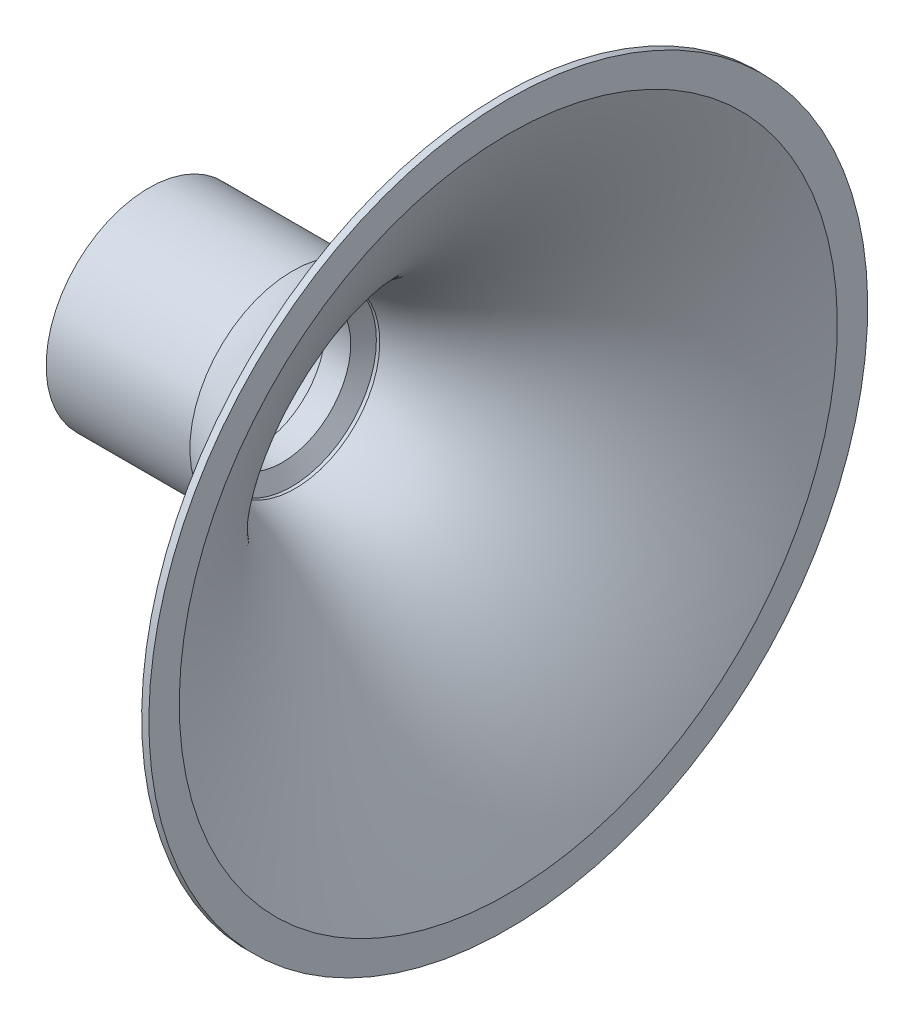
ISO-10303-21;
HEADER;
FILE_DESCRIPTION(('STEP AP214'),'2;1');
FILE_NAME('part.step','',(''),(''),'','','');
FILE_SCHEMA(('AUTOMOTIVE_DESIGN { 1 0 10303 214 1 1 1 1 }'));
ENDSEC;
DATA;
#1=APPLICATION_CONTEXT('core data for automotive mechanical design processes');
#2=APPLICATION_PROTOCOL_DEFINITION('international standard','automotive_design',2000,#1);
#3=PRODUCT_CONTEXT('',#1,'mechanical');
#4=PRODUCT('Part','Part','',(#3));
#5=PRODUCT_RELATED_PRODUCT_CATEGORY('part','',(#4));
#6=PRODUCT_DEFINITION_FORMATION('','',#4);
#7=PRODUCT_DEFINITION_CONTEXT('part definition',#1,'design');
#8=PRODUCT_DEFINITION('design','',#6,#7);
#9=PRODUCT_DEFINITION_SHAPE('','',#8);
#10=(LENGTH_UNIT() NAMED_UNIT(*) SI_UNIT(.MILLI.,.METRE.));
#11=(NAMED_UNIT(*) PLANE_ANGLE_UNIT() SI_UNIT($,.RADIAN.));
#12=(NAMED_UNIT(*) SI_UNIT($,.STERADIAN.) SOLID_ANGLE_UNIT());
#13=UNCERTAINTY_MEASURE_WITH_UNIT(LENGTH_MEASURE(1.E-05),#10,'distance_accuracy_value','');
#14=(GEOMETRIC_REPRESENTATION_CONTEXT(3) GLOBAL_UNCERTAINTY_ASSIGNED_CONTEXT((#13)) GLOBAL_UNIT_ASSIGNED_CONTEXT((#10,
#11,#12)) REPRESENTATION_CONTEXT('',''));
#15=CARTESIAN_POINT('',(0.,0.,0.));
#16=DIRECTION('',(0.,0.,1.));
#17=DIRECTION('',(1.,0.,0.));
#18=AXIS2_PLACEMENT_3D('',#15,#16,#17);
#19=CARTESIAN_POINT('',(20.,0.,0.));
#20=DIRECTION('',(-1.,0.,0.));
#21=DIRECTION('',(0.,0.,1.));
#22=AXIS2_PLACEMENT_3D('',#19,#20,#21);
#23=CYLINDRICAL_SURFACE('',#22,11.3);
#24=CARTESIAN_POINT('',(0.999999999999987,0.,0.));
#25=DIRECTION('',(1.,0.,0.));
#26=DIRECTION('',(0.,0.,-1.));
#27=AXIS2_PLACEMENT_3D('',#24,#25,#26);
#28=CIRCLE('',#27,11.3);
#29=CARTESIAN_POINT('',(0.999999999999987,0.,-11.3));
#30=VERTEX_POINT('',#29);
#31=EDGE_CURVE('E10',#30,#30,#28,.F.);
#32=ORIENTED_EDGE('',*,*,#31,.T.);
#33=EDGE_LOOP('',(#32));
#34=FACE_BOUND('',#33,.T.);
#35=CARTESIAN_POINT('',(15.,0.,0.));
#36=DIRECTION('',(1.,0.,0.));
#37=DIRECTION('',(0.,0.,-1.));
#38=AXIS2_PLACEMENT_3D('',#35,#36,#37);
#39=CIRCLE('',#38,11.3);
#40=CARTESIAN_POINT('',(15.,0.,-11.3));
#41=VERTEX_POINT('',#40);
#42=EDGE_CURVE('E147',#41,#41,#39,.T.);
#43=ORIENTED_EDGE('',*,*,#42,.T.);
#44=EDGE_LOOP('',(#43));
#45=FACE_BOUND('',#44,.T.);
#46=ADVANCED_FACE('F44',(#34,#45),#23,.F.);
#47=CARTESIAN_POINT('',(0.,0.,0.));
#48=DIRECTION('',(1.,0.,0.));
#49=DIRECTION('',(0.,0.,-1.));
#50=AXIS2_PLACEMENT_3D('',#47,#48,#49);
#51=PLANE('',#50);
#52=CARTESIAN_POINT('',(0.,0.,0.));
#53=DIRECTION('',(1.,0.,0.));
#54=DIRECTION('',(0.,0.,-1.));
#55=AXIS2_PLACEMENT_3D('',#52,#53,#54);
#56=CIRCLE('',#55,11.8773502691896);
#57=CARTESIAN_POINT('',(0.,0.,-11.8773502691896));
#58=VERTEX_POINT('',#57);
#59=EDGE_CURVE('E53',#58,#58,#56,.T.);
#60=ORIENTED_EDGE('',*,*,#59,.T.);
#61=EDGE_LOOP('',(#60));
#62=FACE_BOUND('',#61,.T.);
#63=CARTESIAN_POINT('',(0.,0.,0.));
#64=DIRECTION('',(1.,0.,0.));
#65=DIRECTION('',(0.,0.,-1.));
#66=AXIS2_PLACEMENT_3D('',#63,#64,#65);
#67=CIRCLE('',#66,14.2875);
#68=CARTESIAN_POINT('',(0.,0.,-14.2875));
#69=VERTEX_POINT('',#68);
#70=EDGE_CURVE('E70',#69,#69,#67,.T.);
#71=ORIENTED_EDGE('',*,*,#70,.F.);
#72=EDGE_LOOP('',(#71));
#73=FACE_BOUND('',#72,.T.);
#74=ADVANCED_FACE('F118',(#62,#73),#51,.F.);
#75=CARTESIAN_POINT('',(20.,0.,0.));
#76=DIRECTION('',(-1.,0.,0.));
#77=DIRECTION('',(0.,0.,1.));
#78=AXIS2_PLACEMENT_3D('',#75,#76,#77);
#79=CYLINDRICAL_SURFACE('',#78,14.2875);
#80=CARTESIAN_POINT('',(20.,0.,0.));
#81=DIRECTION('',(1.,0.,0.));
#82=DIRECTION('',(0.,0.,-1.));
#83=AXIS2_PLACEMENT_3D('',#80,#81,#82);
#84=CIRCLE('',#83,14.2875);
#85=CARTESIAN_POINT('',(20.,0.,-14.2875));
#86=VERTEX_POINT('',#85);
#87=EDGE_CURVE('E69',#86,#86,#84,.T.);
#88=ORIENTED_EDGE('',*,*,#87,.F.);
#89=EDGE_LOOP('',(#88));
#90=FACE_BOUND('',#89,.T.);
#91=ORIENTED_EDGE('',*,*,#70,.T.);
#92=EDGE_LOOP('',(#91));
#93=FACE_BOUND('',#92,.T.);
#94=ADVANCED_FACE('F105',(#90,#93),#79,.T.);
#95=CARTESIAN_POINT('',(49.,50.,0.));
#96=CARTESIAN_POINT('',(43.5554971357844,35.6762145809936,0.));
#97=CARTESIAN_POINT('',(33.0006143957707,17.8677196718927,0.));
#98=CARTESIAN_POINT('',(20.,14.2875,0.));
#99=CARTESIAN_POINT('',(19.8699938560423,14.2516978032811,0.));
#100=CARTESIAN_POINT('',(19.7399877120846,14.2158956065621,0.));
#101=CARTESIAN_POINT('',(19.6099815681269,14.1800934098432,0.));
#102=B_SPLINE_CURVE_WITH_KNOTS('',3,(#95,#96,#97,#98,#99,#100,#101),.UNSPECIFIED.,.F.,.F.,(4,3,
4),(0.,0.891174337004506,0.900086080374551),.UNSPECIFIED.);
#103=CARTESIAN_POINT('',(50.,0.,0.));
#104=DIRECTION('',(1.,0.,0.));
#105=AXIS1_PLACEMENT('',#103,#104);
#106=SURFACE_OF_REVOLUTION('',#102,#105);
#107=ORIENTED_EDGE('',*,*,#87,.T.);
#108=EDGE_LOOP('',(#107));
#109=FACE_BOUND('',#108,.T.);
#110=CARTESIAN_POINT('',(49.,0.,0.));
#111=DIRECTION('',(1.,0.,0.));
#112=DIRECTION('',(0.,1.,0.));
#113=AXIS2_PLACEMENT_3D('',#110,#111,#112);
#114=CIRCLE('',#113,50.);
#115=CARTESIAN_POINT('',(49.,50.,0.));
#116=VERTEX_POINT('',#115);
#117=EDGE_CURVE('E74',#116,#116,#114,.T.);
#118=ORIENTED_EDGE('',*,*,#117,.F.);
#119=EDGE_LOOP('',(#118));
#120=FACE_BOUND('',#119,.T.);
#121=ADVANCED_FACE('F99',(#109,#120),#106,.F.);
#122=CARTESIAN_POINT('',(50.,0.,0.));
#123=DIRECTION('',(1.,0.,0.));
#124=DIRECTION('',(0.,1.,0.));
#125=AXIS2_PLACEMENT_3D('',#122,#123,#124);
#126=CYLINDRICAL_SURFACE('',#125,50.);
#127=ORIENTED_EDGE('',*,*,#117,.T.);
#128=EDGE_LOOP('',(#127));
#129=FACE_BOUND('',#128,.T.);
#130=CARTESIAN_POINT('',(50.,0.,0.));
#131=DIRECTION('',(1.,0.,0.));
#132=DIRECTION('',(0.,1.,0.));
#133=AXIS2_PLACEMENT_3D('',#130,#131,#132);
#134=CIRCLE('',#133,50.);
#135=CARTESIAN_POINT('',(50.,50.,0.));
#136=VERTEX_POINT('',#135);
#137=EDGE_CURVE('E81',#136,#136,#134,.T.);
#138=ORIENTED_EDGE('',*,*,#137,.F.);
#139=EDGE_LOOP('',(#138));
#140=FACE_BOUND('',#139,.T.);
#141=ADVANCED_FACE('F104',(#129,#140),#126,.T.);
#142=CARTESIAN_POINT('',(50.,50.,0.));
#143=DIRECTION('',(1.,0.,0.));
#144=DIRECTION('',(0.,1.,0.));
#145=AXIS2_PLACEMENT_3D('',#142,#143,#144);
#146=PLANE('',#145);
#147=CARTESIAN_POINT('',(50.,0.,0.));
#148=DIRECTION('',(1.,0.,0.));
#149=DIRECTION('',(0.,1.,0.));
#150=AXIS2_PLACEMENT_3D('',#147,#148,#149);
#151=CIRCLE('',#150,45.7700455626385);
#152=CARTESIAN_POINT('',(50.,45.7700455626385,0.));
#153=VERTEX_POINT('',#152);
#154=EDGE_CURVE('E85',#153,#153,#151,.F.);
#155=ORIENTED_EDGE('',*,*,#154,.T.);
#156=EDGE_LOOP('',(#155));
#157=FACE_BOUND('',#156,.T.);
#158=ORIENTED_EDGE('',*,*,#137,.T.);
#159=EDGE_LOOP('',(#158));
#160=FACE_BOUND('',#159,.T.);
#161=ADVANCED_FACE('F109',(#157,#160),#146,.T.);
#162=CARTESIAN_POINT('',(49.,50.,0.));
#163=CARTESIAN_POINT('',(43.5554971357844,35.6762145809936,0.));
#164=CARTESIAN_POINT('',(33.0006143957707,17.8677196718927,0.));
#165=CARTESIAN_POINT('',(19.8699938560423,14.2516978032811,0.));
#166=CARTESIAN_POINT('',(19.7399877120846,14.2158956065621,0.));
#167=CARTESIAN_POINT('',(19.6099815681269,14.1800934098432,0.));
#168=B_SPLINE_CURVE_WITH_KNOTS('',3,(#162,#163,#164,#165,#166,#167),.UNSPECIFIED.,.F.,.F.,(4,2,
4),(0.,0.891174337004506,0.900086080374551),.UNSPECIFIED.);
#169=CARTESIAN_POINT('',(50.,0.,0.));
#170=DIRECTION('',(1.,0.,0.));
#171=AXIS1_PLACEMENT('',#169,#170);
#172=SURFACE_OF_REVOLUTION('',#168,#171);
#173=OFFSET_SURFACE('',#172,2.5,.F.);
#174=CARTESIAN_POINT('',(20.3379453600405,0.,0.));
#175=DIRECTION('',(1.,0.,0.));
#176=DIRECTION('',(0.,1.,0.));
#177=AXIS2_PLACEMENT_3D('',#174,#175,#176);
#178=CIRCLE('',#177,11.7875);
#179=CARTESIAN_POINT('',(20.3379453600405,11.7875,0.));
#180=VERTEX_POINT('',#179);
#181=EDGE_CURVE('E89',#180,#180,#178,.T.);
#182=ORIENTED_EDGE('',*,*,#181,.F.);
#183=EDGE_LOOP('',(#182));
#184=FACE_BOUND('',#183,.T.);
#185=ORIENTED_EDGE('',*,*,#154,.F.);
#186=EDGE_LOOP('',(#185));
#187=FACE_BOUND('',#186,.T.);
#188=ADVANCED_FACE('F107',(#184,#187),#173,.T.);
#189=CARTESIAN_POINT('',(20.,0.,0.));
#190=DIRECTION('',(-1.,0.,0.));
#191=DIRECTION('',(0.,0.,1.));
#192=AXIS2_PLACEMENT_3D('',#189,#190,#191);
#193=CYLINDRICAL_SURFACE('',#192,11.7875);
#194=CARTESIAN_POINT('',(19.8628793110675,0.,0.));
#195=DIRECTION('',(1.,0.,0.));
#196=DIRECTION('',(0.,0.,-1.));
#197=AXIS2_PLACEMENT_3D('',#194,#195,#196);
#198=CIRCLE('',#197,11.7875);
#199=CARTESIAN_POINT('',(19.8628793110675,0.,-11.7875));
#200=VERTEX_POINT('',#199);
#201=EDGE_CURVE('E58',#200,#200,#198,.F.);
#202=ORIENTED_EDGE('',*,*,#201,.T.);
#203=EDGE_LOOP('',(#202));
#204=FACE_BOUND('',#203,.T.);
#205=ORIENTED_EDGE('',*,*,#181,.T.);
#206=EDGE_LOOP('',(#205));
#207=FACE_BOUND('',#206,.T.);
#208=ADVANCED_FACE('F157',(#204,#207),#193,.F.);
#209=CARTESIAN_POINT('',(15.,0.,0.));
#210=DIRECTION('',(1.,0.,0.));
#211=DIRECTION('',(0.,0.,-1.));
#212=AXIS2_PLACEMENT_3D('',#209,#210,#211);
#213=PLANE('',#212);
#214=CARTESIAN_POINT('',(15.,0.,0.));
#215=DIRECTION('',(1.,0.,0.));
#216=DIRECTION('',(0.,0.,-1.));
#217=AXIS2_PLACEMENT_3D('',#214,#215,#216);
#218=CIRCLE('',#217,9.525);
#219=CARTESIAN_POINT('',(15.,0.,-9.525));
#220=VERTEX_POINT('',#219);
#221=EDGE_CURVE('E144',#220,#220,#218,.T.);
#222=ORIENTED_EDGE('',*,*,#221,.T.);
#223=EDGE_LOOP('',(#222));
#224=FACE_BOUND('',#223,.T.);
#225=ORIENTED_EDGE('',*,*,#42,.F.);
#226=EDGE_LOOP('',(#225));
#227=FACE_BOUND('',#226,.T.);
#228=ADVANCED_FACE('F135',(#224,#227),#213,.F.);
#229=CARTESIAN_POINT('',(15.,0.,0.));
#230=DIRECTION('',(1.,0.,0.));
#231=DIRECTION('',(0.,0.,-1.));
#232=AXIS2_PLACEMENT_3D('',#229,#230,#231);
#233=CYLINDRICAL_SURFACE('',#232,9.525);
#234=CARTESIAN_POINT('',(18.5566243270259,0.,0.));
#235=DIRECTION('',(-1.,0.,0.));
#236=DIRECTION('',(0.,0.,1.));
#237=AXIS2_PLACEMENT_3D('',#234,#235,#236);
#238=CIRCLE('',#237,9.525);
#239=CARTESIAN_POINT('',(18.5566243270259,0.,9.525));
#240=VERTEX_POINT('',#239);
#241=EDGE_CURVE('E63',#240,#240,#238,.F.);
#242=ORIENTED_EDGE('',*,*,#241,.T.);
#243=EDGE_LOOP('',(#242));
#244=FACE_BOUND('',#243,.T.);
#245=ORIENTED_EDGE('',*,*,#221,.F.);
#246=EDGE_LOOP('',(#245));
#247=FACE_BOUND('',#246,.T.);
#248=ADVANCED_FACE('F128',(#244,#247),#233,.F.);
#249=CARTESIAN_POINT('',(18.5566243270259,0.,0.));
#250=DIRECTION('',(1.,0.,0.));
#251=DIRECTION('',(0.,0.,-1.));
#252=AXIS2_PLACEMENT_3D('',#249,#250,#251);
#253=CONICAL_SURFACE('',#252,9.525,1.04719755119659);
#254=ORIENTED_EDGE('',*,*,#201,.F.);
#255=EDGE_LOOP('',(#254));
#256=FACE_BOUND('',#255,.T.);
#257=ORIENTED_EDGE('',*,*,#241,.F.);
#258=EDGE_LOOP('',(#257));
#259=FACE_BOUND('',#258,.T.);
#260=ADVANCED_FACE('F124',(#256,#259),#253,.F.);
#261=CARTESIAN_POINT('',(0.,0.,0.));
#262=DIRECTION('',(-1.,0.,0.));
#263=DIRECTION('',(0.,0.,1.));
#264=AXIS2_PLACEMENT_3D('',#261,#262,#263);
#265=CONICAL_SURFACE('',#264,11.8773502691896,0.523598775598292);
#266=ORIENTED_EDGE('',*,*,#31,.F.);
#267=EDGE_LOOP('',(#266));
#268=FACE_BOUND('',#267,.T.);
#269=ORIENTED_EDGE('',*,*,#59,.F.);
#270=EDGE_LOOP('',(#269));
#271=FACE_BOUND('',#270,.T.);
#272=ADVANCED_FACE('F47',(#268,#271),#265,.F.);
#273=CLOSED_SHELL('',(#46,#74,#94,#121,#141,#161,#188,#208,#228,#248,#260,#272));
#274=MANIFOLD_SOLID_BREP('B2',#273);
#275=ADVANCED_BREP_SHAPE_REPRESENTATION('',(#18,#274),#14);
#276=SHAPE_DEFINITION_REPRESENTATION(#9,#275);
ENDSEC;
END-ISO-10303-21;
